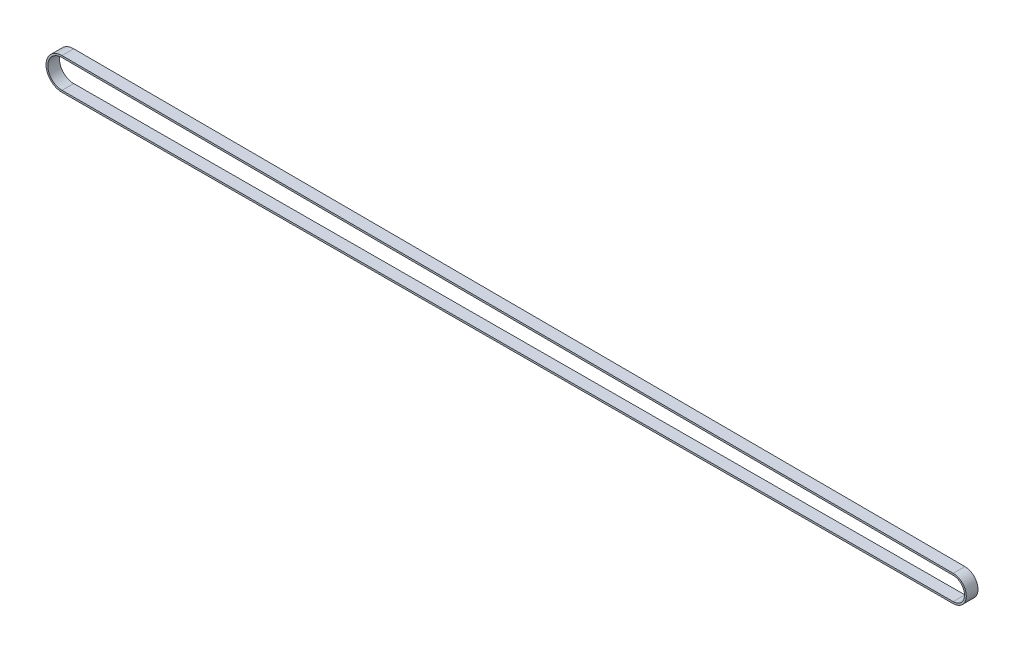
ISO-10303-21;
HEADER;
FILE_DESCRIPTION(('STEP AP214'),'2;1');
FILE_NAME('part.step','',(''),(''),'','','');
FILE_SCHEMA(('AUTOMOTIVE_DESIGN { 1 0 10303 214 1 1 1 1 }'));
ENDSEC;
DATA;
#1=APPLICATION_CONTEXT('core data for automotive mechanical design processes');
#2=APPLICATION_PROTOCOL_DEFINITION('international standard','automotive_design',2000,#1);
#3=PRODUCT_CONTEXT('',#1,'mechanical');
#4=PRODUCT('Part','Part','',(#3));
#5=PRODUCT_RELATED_PRODUCT_CATEGORY('part','',(#4));
#6=PRODUCT_DEFINITION_FORMATION('','',#4);
#7=PRODUCT_DEFINITION_CONTEXT('part definition',#1,'design');
#8=PRODUCT_DEFINITION('design','',#6,#7);
#9=PRODUCT_DEFINITION_SHAPE('','',#8);
#10=(LENGTH_UNIT() NAMED_UNIT(*) SI_UNIT(.MILLI.,.METRE.));
#11=(NAMED_UNIT(*) PLANE_ANGLE_UNIT() SI_UNIT($,.RADIAN.));
#12=(NAMED_UNIT(*) SI_UNIT($,.STERADIAN.) SOLID_ANGLE_UNIT());
#13=UNCERTAINTY_MEASURE_WITH_UNIT(LENGTH_MEASURE(1.E-05),#10,'distance_accuracy_value','');
#14=(GEOMETRIC_REPRESENTATION_CONTEXT(3) GLOBAL_UNCERTAINTY_ASSIGNED_CONTEXT((#13)) GLOBAL_UNIT_ASSIGNED_CONTEXT((#10,
#11,#12)) REPRESENTATION_CONTEXT('',''));
#15=CARTESIAN_POINT('',(0.,0.,0.));
#16=DIRECTION('',(0.,0.,1.));
#17=DIRECTION('',(1.,0.,0.));
#18=AXIS2_PLACEMENT_3D('',#15,#16,#17);
#19=CARTESIAN_POINT('',(-380.5,-12.3159144294469,2.5));
#20=DIRECTION('',(0.,0.,-1.));
#21=DIRECTION('',(-1.,0.,0.));
#22=AXIS2_PLACEMENT_3D('',#19,#20,#21);
#23=CYLINDRICAL_SURFACE('',#22,6.812);
#24=CARTESIAN_POINT('',(-380.5,-12.3159144294469,-2.5));
#25=DIRECTION('',(0.,0.,-1.));
#26=DIRECTION('',(-1.,0.,0.));
#27=AXIS2_PLACEMENT_3D('',#24,#25,#26);
#28=CIRCLE('',#27,6.812);
#29=CARTESIAN_POINT('',(-380.478516688568,-19.1278805529188,-2.5));
#30=VERTEX_POINT('',#29);
#31=CARTESIAN_POINT('',(-380.478516688567,-5.50394830597487,-2.5));
#32=VERTEX_POINT('',#31);
#33=EDGE_CURVE('E157',#30,#32,#28,.T.);
#34=ORIENTED_EDGE('',*,*,#33,.F.);
#35=DIRECTION('',(0.,0.,-1.));
#36=VECTOR('',#35,1.);
#37=CARTESIAN_POINT('',(-380.478516688568,-19.1278805529188,2.5));
#38=LINE('',#37,#36);
#39=CARTESIAN_POINT('',(-380.478516688568,-19.1278805529188,2.5));
#40=VERTEX_POINT('',#39);
#41=EDGE_CURVE('E12',#40,#30,#38,.T.);
#42=ORIENTED_EDGE('',*,*,#41,.F.);
#43=CARTESIAN_POINT('',(-380.5,-12.3159144294469,2.5));
#44=DIRECTION('',(0.,0.,-1.));
#45=DIRECTION('',(-1.,0.,0.));
#46=AXIS2_PLACEMENT_3D('',#43,#44,#45);
#47=CIRCLE('',#46,6.812);
#48=CARTESIAN_POINT('',(-380.478516688567,-5.50394830597487,2.5));
#49=VERTEX_POINT('',#48);
#50=EDGE_CURVE('E161',#40,#49,#47,.T.);
#51=ORIENTED_EDGE('',*,*,#50,.T.);
#52=DIRECTION('',(0.,0.,-1.));
#53=VECTOR('',#52,1.);
#54=CARTESIAN_POINT('',(-380.478516688567,-5.50394830597487,2.5));
#55=LINE('',#54,#53);
#56=EDGE_CURVE('E62',#49,#32,#55,.T.);
#57=ORIENTED_EDGE('',*,*,#56,.T.);
#58=EDGE_LOOP('',(#34,#42,#51,#57));
#59=FACE_BOUND('',#58,.T.);
#60=ADVANCED_FACE('F59',(#59),#23,.T.);
#61=CARTESIAN_POINT('',(-380.478516688568,-19.1278805529188,2.5));
#62=DIRECTION('',(0.00315374507227391,-0.999995026933644,0.));
#63=DIRECTION('',(0.999995026933644,0.00315374507227391,0.));
#64=AXIS2_PLACEMENT_3D('',#61,#62,#63);
#65=PLANE('',#64);
#66=DIRECTION('',(-0.999995026933644,-0.00315374507227391,0.));
#67=VECTOR('',#66,1.);
#68=CARTESIAN_POINT('',(-380.478516688568,-19.1278805529188,-2.5));
#69=LINE('',#68,#67);
#70=CARTESIAN_POINT('',(0.0176988173456173,-17.9278865205982,-2.5));
#71=VERTEX_POINT('',#70);
#72=EDGE_CURVE('E165',#71,#30,#69,.T.);
#73=ORIENTED_EDGE('',*,*,#72,.F.);
#74=DIRECTION('',(0.,0.,-1.));
#75=VECTOR('',#74,1.);
#76=CARTESIAN_POINT('',(0.0176988173456173,-17.9278865205982,2.5));
#77=LINE('',#76,#75);
#78=CARTESIAN_POINT('',(0.0176988173456173,-17.9278865205982,2.5));
#79=VERTEX_POINT('',#78);
#80=EDGE_CURVE('E67',#79,#71,#77,.T.);
#81=ORIENTED_EDGE('',*,*,#80,.F.);
#82=DIRECTION('',(-0.999995026933644,-0.00315374507227391,0.));
#83=VECTOR('',#82,1.);
#84=CARTESIAN_POINT('',(-380.478516688568,-19.1278805529188,2.5));
#85=LINE('',#84,#83);
#86=EDGE_CURVE('E171',#79,#40,#85,.T.);
#87=ORIENTED_EDGE('',*,*,#86,.T.);
#88=ORIENTED_EDGE('',*,*,#41,.T.);
#89=EDGE_LOOP('',(#73,#81,#87,#88));
#90=FACE_BOUND('',#89,.T.);
#91=ADVANCED_FACE('F197',(#90),#65,.T.);
#92=CARTESIAN_POINT('',(0.,-12.3159144294466,2.5));
#93=DIRECTION('',(0.,0.,-1.));
#94=DIRECTION('',(-1.,0.,0.));
#95=AXIS2_PLACEMENT_3D('',#92,#93,#94);
#96=CYLINDRICAL_SURFACE('',#95,5.612);
#97=CARTESIAN_POINT('',(0.,-12.3159144294466,-2.5));
#98=DIRECTION('',(0.,0.,-1.));
#99=DIRECTION('',(-1.,0.,0.));
#100=AXIS2_PLACEMENT_3D('',#97,#98,#99);
#101=CIRCLE('',#100,5.612);
#102=CARTESIAN_POINT('',(0.017698817345646,-6.70394233829502,-2.5));
#103=VERTEX_POINT('',#102);
#104=EDGE_CURVE('E179',#103,#71,#101,.T.);
#105=ORIENTED_EDGE('',*,*,#104,.F.);
#106=DIRECTION('',(0.,0.,-1.));
#107=VECTOR('',#106,1.);
#108=CARTESIAN_POINT('',(0.017698817345646,-6.70394233829502,2.5));
#109=LINE('',#108,#107);
#110=CARTESIAN_POINT('',(0.017698817345646,-6.70394233829502,2.5));
#111=VERTEX_POINT('',#110);
#112=EDGE_CURVE('E184',#111,#103,#109,.T.);
#113=ORIENTED_EDGE('',*,*,#112,.F.);
#114=CARTESIAN_POINT('',(0.,-12.3159144294466,2.5));
#115=DIRECTION('',(0.,0.,-1.));
#116=DIRECTION('',(-1.,0.,0.));
#117=AXIS2_PLACEMENT_3D('',#114,#115,#116);
#118=CIRCLE('',#117,5.612);
#119=EDGE_CURVE('E168',#111,#79,#118,.T.);
#120=ORIENTED_EDGE('',*,*,#119,.T.);
#121=ORIENTED_EDGE('',*,*,#80,.T.);
#122=EDGE_LOOP('',(#105,#113,#120,#121));
#123=FACE_BOUND('',#122,.T.);
#124=ADVANCED_FACE('F201',(#123),#96,.T.);
#125=CARTESIAN_POINT('',(-380.478516688568,-5.50394830597487,2.5));
#126=DIRECTION('',(0.00315374507227274,0.999995026933644,0.));
#127=DIRECTION('',(-0.999995026933644,0.00315374507227274,0.));
#128=AXIS2_PLACEMENT_3D('',#125,#126,#127);
#129=PLANE('',#128);
#130=DIRECTION('',(0.999995026933644,-0.00315374507227274,0.));
#131=VECTOR('',#130,1.);
#132=CARTESIAN_POINT('',(-380.478516688568,-5.50394830597487,-2.5));
#133=LINE('',#132,#131);
#134=EDGE_CURVE('E176',#32,#103,#133,.T.);
#135=ORIENTED_EDGE('',*,*,#134,.F.);
#136=ORIENTED_EDGE('',*,*,#56,.F.);
#137=DIRECTION('',(0.999995026933644,-0.00315374507227274,0.));
#138=VECTOR('',#137,1.);
#139=CARTESIAN_POINT('',(-380.478516688568,-5.50394830597487,2.5));
#140=LINE('',#139,#138);
#141=EDGE_CURVE('E164',#49,#111,#140,.T.);
#142=ORIENTED_EDGE('',*,*,#141,.T.);
#143=ORIENTED_EDGE('',*,*,#112,.T.);
#144=EDGE_LOOP('',(#135,#136,#142,#143));
#145=FACE_BOUND('',#144,.T.);
#146=ADVANCED_FACE('F192',(#145),#129,.T.);
#147=CARTESIAN_POINT('',(-380.5,-12.3159144294469,2.5));
#148=DIRECTION('',(0.,0.,-1.));
#149=DIRECTION('',(-1.,0.,0.));
#150=AXIS2_PLACEMENT_3D('',#147,#148,#149);
#151=PLANE('',#150);
#152=DIRECTION('',(-0.999995026933644,-0.00315374507227391,0.));
#153=VECTOR('',#152,1.);
#154=CARTESIAN_POINT('',(-380.480919842313,-18.3658843423954,2.5));
#155=LINE('',#154,#153);
#156=CARTESIAN_POINT('',(0.0152956636005443,-17.1658903100748,2.5));
#157=VERTEX_POINT('',#156);
#158=CARTESIAN_POINT('',(-380.480919842313,-18.3658843423954,2.5));
#159=VERTEX_POINT('',#158);
#160=EDGE_CURVE('E132',#157,#159,#155,.T.);
#161=ORIENTED_EDGE('',*,*,#160,.T.);
#162=CARTESIAN_POINT('',(-380.5,-12.3159144294469,2.5));
#163=DIRECTION('',(0.,0.,-1.));
#164=DIRECTION('',(-1.,0.,0.));
#165=AXIS2_PLACEMENT_3D('',#162,#163,#164);
#166=CIRCLE('',#165,6.05);
#167=CARTESIAN_POINT('',(-380.480919842313,-6.26594451649831,2.5));
#168=VERTEX_POINT('',#167);
#169=EDGE_CURVE('E126',#159,#168,#166,.T.);
#170=ORIENTED_EDGE('',*,*,#169,.T.);
#171=DIRECTION('',(0.999995026933644,-0.00315374507227274,0.));
#172=VECTOR('',#171,1.);
#173=CARTESIAN_POINT('',(-380.480919842313,-6.2659445164983,2.5));
#174=LINE('',#173,#172);
#175=CARTESIAN_POINT('',(0.0152956636004786,-7.46593854881846,2.5));
#176=VERTEX_POINT('',#175);
#177=EDGE_CURVE('E135',#168,#176,#174,.T.);
#178=ORIENTED_EDGE('',*,*,#177,.T.);
#179=CARTESIAN_POINT('',(0.,-12.3159144294466,2.5));
#180=DIRECTION('',(0.,0.,-1.));
#181=DIRECTION('',(-1.,0.,0.));
#182=AXIS2_PLACEMENT_3D('',#179,#180,#181);
#183=CIRCLE('',#182,4.85);
#184=EDGE_CURVE('E75',#176,#157,#183,.T.);
#185=ORIENTED_EDGE('',*,*,#184,.T.);
#186=EDGE_LOOP('',(#161,#170,#178,#185));
#187=FACE_BOUND('',#186,.T.);
#188=ORIENTED_EDGE('',*,*,#50,.F.);
#189=ORIENTED_EDGE('',*,*,#86,.F.);
#190=ORIENTED_EDGE('',*,*,#119,.F.);
#191=ORIENTED_EDGE('',*,*,#141,.F.);
#192=EDGE_LOOP('',(#188,#189,#190,#191));
#193=FACE_BOUND('',#192,.T.);
#194=ADVANCED_FACE('F139',(#187,#193),#151,.F.);
#195=CARTESIAN_POINT('',(-380.5,-12.3159144294469,-2.5));
#196=DIRECTION('',(0.,0.,-1.));
#197=DIRECTION('',(-1.,0.,0.));
#198=AXIS2_PLACEMENT_3D('',#195,#196,#197);
#199=PLANE('',#198);
#200=CARTESIAN_POINT('',(-380.5,-12.3159144294469,-2.5));
#201=DIRECTION('',(0.,0.,-1.));
#202=DIRECTION('',(-1.,0.,0.));
#203=AXIS2_PLACEMENT_3D('',#200,#201,#202);
#204=CIRCLE('',#203,6.05);
#205=CARTESIAN_POINT('',(-380.480919842313,-18.3658843423954,-2.5));
#206=VERTEX_POINT('',#205);
#207=CARTESIAN_POINT('',(-380.480919842313,-6.26594451649831,-2.5));
#208=VERTEX_POINT('',#207);
#209=EDGE_CURVE('E83',#206,#208,#204,.T.);
#210=ORIENTED_EDGE('',*,*,#209,.F.);
#211=DIRECTION('',(-0.999995026933644,-0.00315374507227391,0.));
#212=VECTOR('',#211,1.);
#213=CARTESIAN_POINT('',(-380.480919842313,-18.3658843423954,-2.5));
#214=LINE('',#213,#212);
#215=CARTESIAN_POINT('',(0.0152956636005443,-17.1658903100748,-2.5));
#216=VERTEX_POINT('',#215);
#217=EDGE_CURVE('E142',#216,#206,#214,.T.);
#218=ORIENTED_EDGE('',*,*,#217,.F.);
#219=CARTESIAN_POINT('',(0.,-12.3159144294466,-2.5));
#220=DIRECTION('',(0.,0.,-1.));
#221=DIRECTION('',(-1.,0.,0.));
#222=AXIS2_PLACEMENT_3D('',#219,#220,#221);
#223=CIRCLE('',#222,4.85);
#224=CARTESIAN_POINT('',(0.0152956636005341,-7.46593854881846,-2.5));
#225=VERTEX_POINT('',#224);
#226=EDGE_CURVE('E145',#225,#216,#223,.T.);
#227=ORIENTED_EDGE('',*,*,#226,.F.);
#228=DIRECTION('',(0.999995026933644,-0.00315374507227274,0.));
#229=VECTOR('',#228,1.);
#230=CARTESIAN_POINT('',(-380.480919842313,-6.2659445164983,-2.5));
#231=LINE('',#230,#229);
#232=EDGE_CURVE('E151',#208,#225,#231,.T.);
#233=ORIENTED_EDGE('',*,*,#232,.F.);
#234=EDGE_LOOP('',(#210,#218,#227,#233));
#235=FACE_BOUND('',#234,.T.);
#236=ORIENTED_EDGE('',*,*,#33,.T.);
#237=ORIENTED_EDGE('',*,*,#134,.T.);
#238=ORIENTED_EDGE('',*,*,#104,.T.);
#239=ORIENTED_EDGE('',*,*,#72,.T.);
#240=EDGE_LOOP('',(#236,#237,#238,#239));
#241=FACE_BOUND('',#240,.T.);
#242=ADVANCED_FACE('F194',(#235,#241),#199,.T.);
#243=CARTESIAN_POINT('',(-380.5,-12.3159144294469,2.5));
#244=DIRECTION('',(0.,0.,-1.));
#245=DIRECTION('',(-1.,0.,0.));
#246=AXIS2_PLACEMENT_3D('',#243,#244,#245);
#247=CYLINDRICAL_SURFACE('',#246,6.05);
#248=ORIENTED_EDGE('',*,*,#209,.T.);
#249=DIRECTION('',(0.,0.,-1.));
#250=VECTOR('',#249,1.);
#251=CARTESIAN_POINT('',(-380.480919842313,-6.26594451649831,2.5));
#252=LINE('',#251,#250);
#253=EDGE_CURVE('E122',#168,#208,#252,.T.);
#254=ORIENTED_EDGE('',*,*,#253,.F.);
#255=ORIENTED_EDGE('',*,*,#169,.F.);
#256=DIRECTION('',(0.,0.,-1.));
#257=VECTOR('',#256,1.);
#258=CARTESIAN_POINT('',(-380.480919842313,-18.3658843423954,2.5));
#259=LINE('',#258,#257);
#260=EDGE_CURVE('E155',#159,#206,#259,.T.);
#261=ORIENTED_EDGE('',*,*,#260,.T.);
#262=EDGE_LOOP('',(#248,#254,#255,#261));
#263=FACE_BOUND('',#262,.T.);
#264=ADVANCED_FACE('F124',(#263),#247,.F.);
#265=CARTESIAN_POINT('',(-380.480919842313,-18.3658843423954,2.5));
#266=DIRECTION('',(0.00315374507227391,-0.999995026933644,0.));
#267=DIRECTION('',(0.999995026933644,0.00315374507227391,0.));
#268=AXIS2_PLACEMENT_3D('',#265,#266,#267);
#269=PLANE('',#268);
#270=ORIENTED_EDGE('',*,*,#217,.T.);
#271=ORIENTED_EDGE('',*,*,#260,.F.);
#272=ORIENTED_EDGE('',*,*,#160,.F.);
#273=DIRECTION('',(0.,0.,-1.));
#274=VECTOR('',#273,1.);
#275=CARTESIAN_POINT('',(0.0152956636005443,-17.1658903100748,2.5));
#276=LINE('',#275,#274);
#277=EDGE_CURVE('E158',#157,#216,#276,.T.);
#278=ORIENTED_EDGE('',*,*,#277,.T.);
#279=EDGE_LOOP('',(#270,#271,#272,#278));
#280=FACE_BOUND('',#279,.T.);
#281=ADVANCED_FACE('F252',(#280),#269,.F.);
#282=CARTESIAN_POINT('',(0.,-12.3159144294466,2.5));
#283=DIRECTION('',(0.,0.,-1.));
#284=DIRECTION('',(-1.,0.,0.));
#285=AXIS2_PLACEMENT_3D('',#282,#283,#284);
#286=CYLINDRICAL_SURFACE('',#285,4.85);
#287=ORIENTED_EDGE('',*,*,#226,.T.);
#288=ORIENTED_EDGE('',*,*,#277,.F.);
#289=ORIENTED_EDGE('',*,*,#184,.F.);
#290=DIRECTION('',(0.,0.,-1.));
#291=VECTOR('',#290,1.);
#292=CARTESIAN_POINT('',(0.0152956636005341,-7.46593854881846,2.5));
#293=LINE('',#292,#291);
#294=EDGE_CURVE('E131',#176,#225,#293,.T.);
#295=ORIENTED_EDGE('',*,*,#294,.T.);
#296=EDGE_LOOP('',(#287,#288,#289,#295));
#297=FACE_BOUND('',#296,.T.);
#298=ADVANCED_FACE('F261',(#297),#286,.F.);
#299=CARTESIAN_POINT('',(-380.480919842313,-6.2659445164983,2.5));
#300=DIRECTION('',(0.00315374507227274,0.999995026933644,0.));
#301=DIRECTION('',(-0.999995026933644,0.00315374507227274,0.));
#302=AXIS2_PLACEMENT_3D('',#299,#300,#301);
#303=PLANE('',#302);
#304=ORIENTED_EDGE('',*,*,#232,.T.);
#305=ORIENTED_EDGE('',*,*,#294,.F.);
#306=ORIENTED_EDGE('',*,*,#177,.F.);
#307=ORIENTED_EDGE('',*,*,#253,.T.);
#308=EDGE_LOOP('',(#304,#305,#306,#307));
#309=FACE_BOUND('',#308,.T.);
#310=ADVANCED_FACE('F136',(#309),#303,.F.);
#311=CLOSED_SHELL('',(#60,#91,#124,#146,#194,#242,#264,#281,#298,#310));
#312=MANIFOLD_SOLID_BREP('B2',#311);
#313=ADVANCED_BREP_SHAPE_REPRESENTATION('',(#18,#312),#14);
#314=SHAPE_DEFINITION_REPRESENTATION(#9,#313);
ENDSEC;
END-ISO-10303-21;
